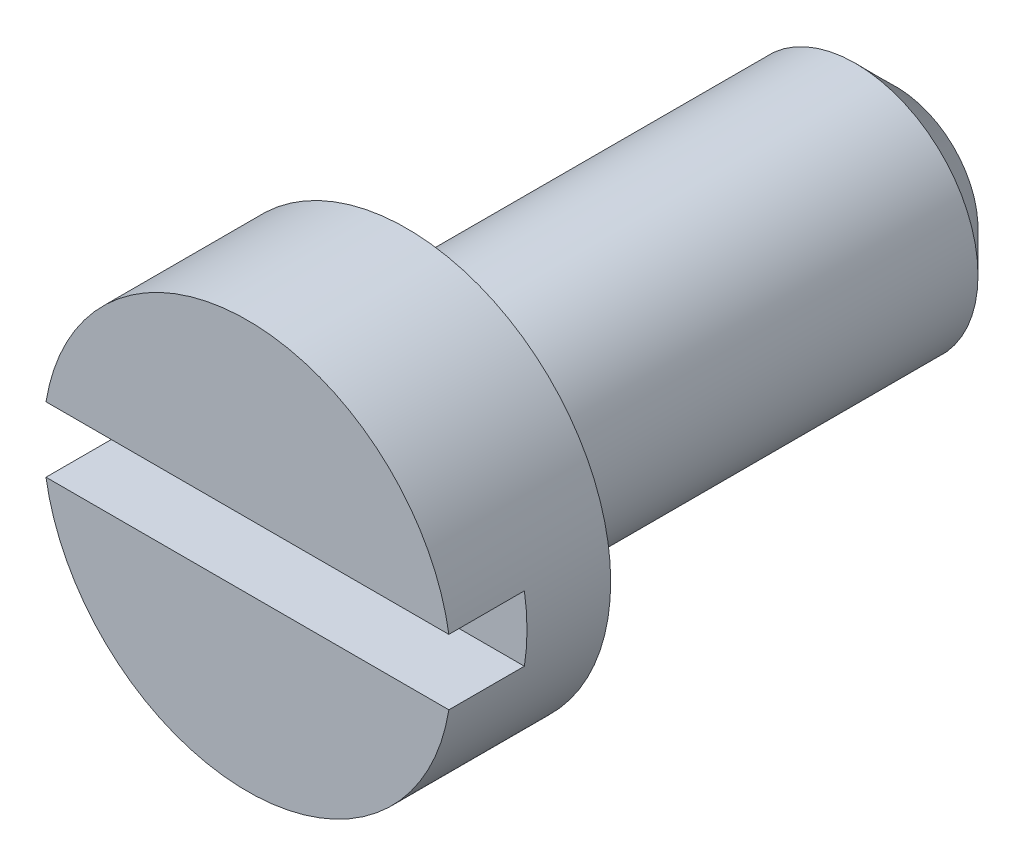
ISO-10303-21;
HEADER;
FILE_DESCRIPTION(('STEP AP214'),'2;1');
FILE_NAME('part.step','',(''),(''),'','','');
FILE_SCHEMA(('AUTOMOTIVE_DESIGN { 1 0 10303 214 1 1 1 1 }'));
ENDSEC;
DATA;
#1=APPLICATION_CONTEXT('core data for automotive mechanical design processes');
#2=APPLICATION_PROTOCOL_DEFINITION('international standard','automotive_design',2000,#1);
#3=PRODUCT_CONTEXT('',#1,'mechanical');
#4=PRODUCT('Part','Part','',(#3));
#5=PRODUCT_RELATED_PRODUCT_CATEGORY('part','',(#4));
#6=PRODUCT_DEFINITION_FORMATION('','',#4);
#7=PRODUCT_DEFINITION_CONTEXT('part definition',#1,'design');
#8=PRODUCT_DEFINITION('design','',#6,#7);
#9=PRODUCT_DEFINITION_SHAPE('','',#8);
#10=(LENGTH_UNIT() NAMED_UNIT(*) SI_UNIT(.MILLI.,.METRE.));
#11=(NAMED_UNIT(*) PLANE_ANGLE_UNIT() SI_UNIT($,.RADIAN.));
#12=(NAMED_UNIT(*) SI_UNIT($,.STERADIAN.) SOLID_ANGLE_UNIT());
#13=UNCERTAINTY_MEASURE_WITH_UNIT(LENGTH_MEASURE(1.E-05),#10,'distance_accuracy_value','');
#14=(GEOMETRIC_REPRESENTATION_CONTEXT(3) GLOBAL_UNCERTAINTY_ASSIGNED_CONTEXT((#13)) GLOBAL_UNIT_ASSIGNED_CONTEXT((#10,
#11,#12)) REPRESENTATION_CONTEXT('',''));
#15=CARTESIAN_POINT('',(0.,0.,0.));
#16=DIRECTION('',(0.,0.,1.));
#17=DIRECTION('',(1.,0.,0.));
#18=AXIS2_PLACEMENT_3D('',#15,#16,#17);
#19=CARTESIAN_POINT('',(0.,0.,3.9));
#20=DIRECTION('',(0.,0.,1.));
#21=DIRECTION('',(1.,0.,0.));
#22=AXIS2_PLACEMENT_3D('',#19,#20,#21);
#23=PLANE('',#22);
#24=DIRECTION('',(-1.,0.,0.));
#25=VECTOR('',#24,1.);
#26=CARTESIAN_POINT('',(0.,0.8,3.9));
#27=LINE('',#26,#25);
#28=CARTESIAN_POINT('',(4.93558507170123,0.8,3.9));
#29=VERTEX_POINT('',#28);
#30=CARTESIAN_POINT('',(-4.93558507170123,0.8,3.9));
#31=VERTEX_POINT('',#30);
#32=EDGE_CURVE('E77',#29,#31,#27,.T.);
#33=ORIENTED_EDGE('',*,*,#32,.F.);
#34=CARTESIAN_POINT('',(0.,0.,3.9));
#35=DIRECTION('',(0.,0.,1.));
#36=DIRECTION('',(1.,0.,0.));
#37=AXIS2_PLACEMENT_3D('',#34,#35,#36);
#38=CIRCLE('',#37,5.);
#39=EDGE_CURVE('E90',#29,#31,#38,.T.);
#40=ORIENTED_EDGE('',*,*,#39,.T.);
#41=EDGE_LOOP('',(#33,#40));
#42=FACE_BOUND('',#41,.T.);
#43=ADVANCED_FACE('F29',(#42),#23,.T.);
#44=CARTESIAN_POINT('',(0.,0.,0.));
#45=DIRECTION('',(0.,0.,1.));
#46=DIRECTION('',(1.,0.,0.));
#47=AXIS2_PLACEMENT_3D('',#44,#45,#46);
#48=PLANE('',#47);
#49=CARTESIAN_POINT('',(0.,0.,0.));
#50=DIRECTION('',(0.,0.,1.));
#51=DIRECTION('',(1.,0.,0.));
#52=AXIS2_PLACEMENT_3D('',#49,#50,#51);
#53=CIRCLE('',#52,5.);
#54=CARTESIAN_POINT('',(5.,0.,0.));
#55=VERTEX_POINT('',#54);
#56=EDGE_CURVE('E91',#55,#55,#53,.T.);
#57=ORIENTED_EDGE('',*,*,#56,.F.);
#58=EDGE_LOOP('',(#57));
#59=FACE_BOUND('',#58,.T.);
#60=CARTESIAN_POINT('',(0.,0.,0.));
#61=DIRECTION('',(0.,0.,1.));
#62=DIRECTION('',(1.,0.,0.));
#63=AXIS2_PLACEMENT_3D('',#60,#61,#62);
#64=CIRCLE('',#63,3.);
#65=CARTESIAN_POINT('',(3.,0.,0.));
#66=VERTEX_POINT('',#65);
#67=EDGE_CURVE('E78',#66,#66,#64,.F.);
#68=ORIENTED_EDGE('',*,*,#67,.F.);
#69=EDGE_LOOP('',(#68));
#70=FACE_BOUND('',#69,.T.);
#71=ADVANCED_FACE('F118',(#59,#70),#48,.F.);
#72=CARTESIAN_POINT('',(0.,0.,3.9));
#73=DIRECTION('',(0.,0.,-1.));
#74=DIRECTION('',(-1.,0.,0.));
#75=AXIS2_PLACEMENT_3D('',#72,#73,#74);
#76=CYLINDRICAL_SURFACE('',#75,5.);
#77=CARTESIAN_POINT('',(0.,0.,2.05));
#78=DIRECTION('',(0.,0.,1.));
#79=DIRECTION('',(1.,0.,0.));
#80=AXIS2_PLACEMENT_3D('',#77,#78,#79);
#81=CIRCLE('',#80,5.);
#82=CARTESIAN_POINT('',(-4.93558507170123,0.8,2.05));
#83=VERTEX_POINT('',#82);
#84=CARTESIAN_POINT('',(-4.93558507170123,-0.8,2.05));
#85=VERTEX_POINT('',#84);
#86=EDGE_CURVE('E102',#83,#85,#81,.T.);
#87=ORIENTED_EDGE('',*,*,#86,.F.);
#88=DIRECTION('',(0.,0.,-1.));
#89=VECTOR('',#88,1.);
#90=CARTESIAN_POINT('',(-4.93558507170123,0.8,3.9));
#91=LINE('',#90,#89);
#92=EDGE_CURVE('E52',#83,#31,#91,.F.);
#93=ORIENTED_EDGE('',*,*,#92,.T.);
#94=ORIENTED_EDGE('',*,*,#39,.F.);
#95=DIRECTION('',(0.,0.,-1.));
#96=VECTOR('',#95,1.);
#97=CARTESIAN_POINT('',(4.93558507170123,0.8,3.9));
#98=LINE('',#97,#96);
#99=CARTESIAN_POINT('',(4.93558507170123,0.8,2.05));
#100=VERTEX_POINT('',#99);
#101=EDGE_CURVE('E95',#29,#100,#98,.T.);
#102=ORIENTED_EDGE('',*,*,#101,.T.);
#103=CARTESIAN_POINT('',(4.93558507170123,-0.8,2.05));
#104=VERTEX_POINT('',#103);
#105=EDGE_CURVE('E86',#104,#100,#81,.T.);
#106=ORIENTED_EDGE('',*,*,#105,.F.);
#107=DIRECTION('',(0.,0.,-1.));
#108=VECTOR('',#107,1.);
#109=CARTESIAN_POINT('',(4.93558507170123,-0.8,3.9));
#110=LINE('',#109,#108);
#111=CARTESIAN_POINT('',(4.93558507170123,-0.8,3.9));
#112=VERTEX_POINT('',#111);
#113=EDGE_CURVE('E72',#104,#112,#110,.F.);
#114=ORIENTED_EDGE('',*,*,#113,.T.);
#115=CARTESIAN_POINT('',(-4.93558507170123,-0.8,3.9));
#116=VERTEX_POINT('',#115);
#117=EDGE_CURVE('E84',#116,#112,#38,.T.);
#118=ORIENTED_EDGE('',*,*,#117,.F.);
#119=DIRECTION('',(0.,0.,-1.));
#120=VECTOR('',#119,1.);
#121=CARTESIAN_POINT('',(-4.93558507170123,-0.8,3.9));
#122=LINE('',#121,#120);
#123=EDGE_CURVE('E44',#116,#85,#122,.T.);
#124=ORIENTED_EDGE('',*,*,#123,.T.);
#125=EDGE_LOOP('',(#87,#93,#94,#102,#106,#114,#118,#124));
#126=FACE_BOUND('',#125,.T.);
#127=ORIENTED_EDGE('',*,*,#56,.T.);
#128=EDGE_LOOP('',(#127));
#129=FACE_BOUND('',#128,.T.);
#130=ADVANCED_FACE('F31',(#126,#129),#76,.T.);
#131=DIRECTION('',(1.,0.,0.));
#132=VECTOR('',#131,1.);
#133=CARTESIAN_POINT('',(0.,-0.8,3.9));
#134=LINE('',#133,#132);
#135=EDGE_CURVE('E69',#116,#112,#134,.T.);
#136=ORIENTED_EDGE('',*,*,#135,.F.);
#137=ORIENTED_EDGE('',*,*,#117,.T.);
#138=EDGE_LOOP('',(#136,#137));
#139=FACE_BOUND('',#138,.T.);
#140=ADVANCED_FACE('F89',(#139),#23,.T.);
#141=CARTESIAN_POINT('',(0.,0.,-12.));
#142=DIRECTION('',(0.,0.,1.));
#143=DIRECTION('',(1.,0.,0.));
#144=AXIS2_PLACEMENT_3D('',#141,#142,#143);
#145=CYLINDRICAL_SURFACE('',#144,3.);
#146=CARTESIAN_POINT('',(0.,0.,-11.));
#147=DIRECTION('',(0.,0.,-1.));
#148=DIRECTION('',(-1.,0.,0.));
#149=AXIS2_PLACEMENT_3D('',#146,#147,#148);
#150=CIRCLE('',#149,3.);
#151=CARTESIAN_POINT('',(-3.,0.,-11.));
#152=VERTEX_POINT('',#151);
#153=EDGE_CURVE('E11',#152,#152,#150,.F.);
#154=ORIENTED_EDGE('',*,*,#153,.T.);
#155=EDGE_LOOP('',(#154));
#156=FACE_BOUND('',#155,.T.);
#157=ORIENTED_EDGE('',*,*,#67,.T.);
#158=EDGE_LOOP('',(#157));
#159=FACE_BOUND('',#158,.T.);
#160=ADVANCED_FACE('F126',(#156,#159),#145,.T.);
#161=CARTESIAN_POINT('',(0.,0.,-12.));
#162=DIRECTION('',(0.,0.,-1.));
#163=DIRECTION('',(-1.,0.,0.));
#164=AXIS2_PLACEMENT_3D('',#161,#162,#163);
#165=PLANE('',#164);
#166=CARTESIAN_POINT('',(0.,0.,-12.));
#167=DIRECTION('',(0.,0.,-1.));
#168=DIRECTION('',(-1.,0.,0.));
#169=AXIS2_PLACEMENT_3D('',#166,#167,#168);
#170=CIRCLE('',#169,2.);
#171=CARTESIAN_POINT('',(-2.,0.,-12.));
#172=VERTEX_POINT('',#171);
#173=EDGE_CURVE('E37',#172,#172,#170,.T.);
#174=ORIENTED_EDGE('',*,*,#173,.T.);
#175=EDGE_LOOP('',(#174));
#176=FACE_BOUND('',#175,.T.);
#177=ADVANCED_FACE('F131',(#176),#165,.T.);
#178=CARTESIAN_POINT('',(-5.2723311546841,-0.8,2.05));
#179=DIRECTION('',(0.,0.,1.));
#180=DIRECTION('',(1.,0.,0.));
#181=AXIS2_PLACEMENT_3D('',#178,#179,#180);
#182=PLANE('',#181);
#183=ORIENTED_EDGE('',*,*,#86,.T.);
#184=DIRECTION('',(1.,0.,0.));
#185=VECTOR('',#184,1.);
#186=CARTESIAN_POINT('',(-5.2723311546841,-0.8,2.05));
#187=LINE('',#186,#185);
#188=EDGE_CURVE('E108',#85,#104,#187,.T.);
#189=ORIENTED_EDGE('',*,*,#188,.T.);
#190=ORIENTED_EDGE('',*,*,#105,.T.);
#191=DIRECTION('',(-1.,0.,0.));
#192=VECTOR('',#191,1.);
#193=CARTESIAN_POINT('',(-5.2723311546841,0.8,2.05));
#194=LINE('',#193,#192);
#195=EDGE_CURVE('E87',#100,#83,#194,.T.);
#196=ORIENTED_EDGE('',*,*,#195,.T.);
#197=EDGE_LOOP('',(#183,#189,#190,#196));
#198=FACE_BOUND('',#197,.T.);
#199=ADVANCED_FACE('F107',(#198),#182,.T.);
#200=CARTESIAN_POINT('',(-5.2723311546841,0.8,2.05));
#201=DIRECTION('',(0.,1.,0.));
#202=DIRECTION('',(0.,0.,1.));
#203=AXIS2_PLACEMENT_3D('',#200,#201,#202);
#204=PLANE('',#203);
#205=ORIENTED_EDGE('',*,*,#32,.T.);
#206=ORIENTED_EDGE('',*,*,#92,.F.);
#207=ORIENTED_EDGE('',*,*,#195,.F.);
#208=ORIENTED_EDGE('',*,*,#101,.F.);
#209=EDGE_LOOP('',(#205,#206,#207,#208));
#210=FACE_BOUND('',#209,.T.);
#211=ADVANCED_FACE('F115',(#210),#204,.F.);
#212=CARTESIAN_POINT('',(-5.2723311546841,-0.8,2.05));
#213=DIRECTION('',(0.,-1.,0.));
#214=DIRECTION('',(0.,0.,-1.));
#215=AXIS2_PLACEMENT_3D('',#212,#213,#214);
#216=PLANE('',#215);
#217=ORIENTED_EDGE('',*,*,#135,.T.);
#218=ORIENTED_EDGE('',*,*,#113,.F.);
#219=ORIENTED_EDGE('',*,*,#188,.F.);
#220=ORIENTED_EDGE('',*,*,#123,.F.);
#221=EDGE_LOOP('',(#217,#218,#219,#220));
#222=FACE_BOUND('',#221,.T.);
#223=ADVANCED_FACE('F71',(#222),#216,.F.);
#224=CARTESIAN_POINT('',(0.,0.,-12.));
#225=DIRECTION('',(0.,0.,1.));
#226=DIRECTION('',(1.,0.,0.));
#227=AXIS2_PLACEMENT_3D('',#224,#225,#226);
#228=CONICAL_SURFACE('',#227,2.,0.785398163397447);
#229=ORIENTED_EDGE('',*,*,#153,.F.);
#230=EDGE_LOOP('',(#229));
#231=FACE_BOUND('',#230,.T.);
#232=ORIENTED_EDGE('',*,*,#173,.F.);
#233=EDGE_LOOP('',(#232));
#234=FACE_BOUND('',#233,.T.);
#235=ADVANCED_FACE('F173',(#231,#234),#228,.T.);
#236=CLOSED_SHELL('',(#43,#71,#130,#140,#160,#177,#199,#211,#223,#235));
#237=MANIFOLD_SOLID_BREP('B2',#236);
#238=ADVANCED_BREP_SHAPE_REPRESENTATION('',(#18,#237),#14);
#239=SHAPE_DEFINITION_REPRESENTATION(#9,#238);
ENDSEC;
END-ISO-10303-21;
